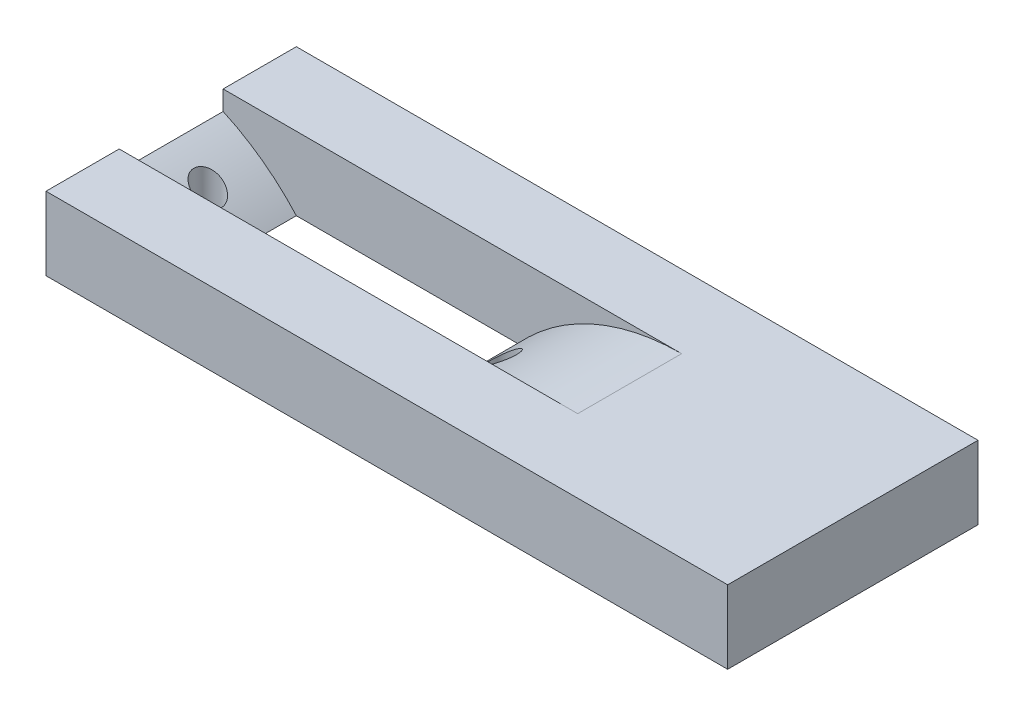
ISO-10303-21;
HEADER;
FILE_DESCRIPTION(('STEP AP214'),'2;1');
FILE_NAME('part.step','',(''),(''),'','','');
FILE_SCHEMA(('AUTOMOTIVE_DESIGN { 1 0 10303 214 1 1 1 1 }'));
ENDSEC;
DATA;
#1=APPLICATION_CONTEXT('core data for automotive mechanical design processes');
#2=APPLICATION_PROTOCOL_DEFINITION('international standard','automotive_design',2000,#1);
#3=PRODUCT_CONTEXT('',#1,'mechanical');
#4=PRODUCT('Part','Part','',(#3));
#5=PRODUCT_RELATED_PRODUCT_CATEGORY('part','',(#4));
#6=PRODUCT_DEFINITION_FORMATION('','',#4);
#7=PRODUCT_DEFINITION_CONTEXT('part definition',#1,'design');
#8=PRODUCT_DEFINITION('design','',#6,#7);
#9=PRODUCT_DEFINITION_SHAPE('','',#8);
#10=(LENGTH_UNIT() NAMED_UNIT(*) SI_UNIT(.MILLI.,.METRE.));
#11=(NAMED_UNIT(*) PLANE_ANGLE_UNIT() SI_UNIT($,.RADIAN.));
#12=(NAMED_UNIT(*) SI_UNIT($,.STERADIAN.) SOLID_ANGLE_UNIT());
#13=UNCERTAINTY_MEASURE_WITH_UNIT(LENGTH_MEASURE(1.E-05),#10,'distance_accuracy_value','');
#14=(GEOMETRIC_REPRESENTATION_CONTEXT(3) GLOBAL_UNCERTAINTY_ASSIGNED_CONTEXT((#13)) GLOBAL_UNIT_ASSIGNED_CONTEXT((#10,
#11,#12)) REPRESENTATION_CONTEXT('',''));
#15=CARTESIAN_POINT('',(0.,0.,0.));
#16=DIRECTION('',(0.,0.,1.));
#17=DIRECTION('',(1.,0.,0.));
#18=AXIS2_PLACEMENT_3D('',#15,#16,#17);
#19=CARTESIAN_POINT('',(0.,15.7457363650206,0.));
#20=DIRECTION('',(0.,-1.,0.));
#21=DIRECTION('',(0.,0.,-1.));
#22=AXIS2_PLACEMENT_3D('',#19,#20,#21);
#23=PLANE('',#22);
#24=CARTESIAN_POINT('',(-48.9900000000017,15.7457363650206,0.));
#25=DIRECTION('',(0.,1.,0.));
#26=DIRECTION('',(0.,0.,1.));
#27=AXIS2_PLACEMENT_3D('',#24,#25,#26);
#28=CIRCLE('',#27,1.91000000000001);
#29=CARTESIAN_POINT('',(-48.9900000000017,15.7457363650206,1.91000000000001));
#30=VERTEX_POINT('',#29);
#31=EDGE_CURVE('E235',#30,#30,#28,.T.);
#32=ORIENTED_EDGE('',*,*,#31,.T.);
#33=EDGE_LOOP('',(#32));
#34=FACE_BOUND('',#33,.T.);
#35=CARTESIAN_POINT('',(-8.71000000000389,15.7457363650206,0.));
#36=DIRECTION('',(0.,1.,0.));
#37=DIRECTION('',(0.,0.,1.));
#38=AXIS2_PLACEMENT_3D('',#35,#36,#37);
#39=CIRCLE('',#38,1.91);
#40=CARTESIAN_POINT('',(-8.71000000000389,15.7457363650206,1.91));
#41=VERTEX_POINT('',#40);
#42=EDGE_CURVE('E234',#41,#41,#39,.T.);
#43=ORIENTED_EDGE('',*,*,#42,.T.);
#44=EDGE_LOOP('',(#43));
#45=FACE_BOUND('',#44,.T.);
#46=DIRECTION('',(0.,0.,-1.));
#47=VECTOR('',#46,1.);
#48=CARTESIAN_POINT('',(-43.99,15.7457363650206,0.));
#49=LINE('',#48,#47);
#50=CARTESIAN_POINT('',(-43.99,15.7457363650206,7.1));
#51=VERTEX_POINT('',#50);
#52=CARTESIAN_POINT('',(-43.99,15.7457363650206,-7.1));
#53=VERTEX_POINT('',#52);
#54=EDGE_CURVE('E163',#51,#53,#49,.T.);
#55=ORIENTED_EDGE('',*,*,#54,.F.);
#56=DIRECTION('',(-1.,0.,0.));
#57=VECTOR('',#56,1.);
#58=CARTESIAN_POINT('',(0.,15.7457363650206,7.1));
#59=LINE('',#58,#57);
#60=CARTESIAN_POINT('',(-13.71,15.7457363650206,7.1));
#61=VERTEX_POINT('',#60);
#62=EDGE_CURVE('E171',#61,#51,#59,.T.);
#63=ORIENTED_EDGE('',*,*,#62,.F.);
#64=DIRECTION('',(0.,0.,1.));
#65=VECTOR('',#64,1.);
#66=CARTESIAN_POINT('',(-13.71,15.7457363650206,0.));
#67=LINE('',#66,#65);
#68=CARTESIAN_POINT('',(-13.71,15.7457363650206,-7.1));
#69=VERTEX_POINT('',#68);
#70=EDGE_CURVE('E177',#69,#61,#67,.T.);
#71=ORIENTED_EDGE('',*,*,#70,.F.);
#72=DIRECTION('',(1.,0.,0.));
#73=VECTOR('',#72,1.);
#74=CARTESIAN_POINT('',(0.,15.7457363650206,-7.1));
#75=LINE('',#74,#73);
#76=EDGE_CURVE('E183',#53,#69,#75,.T.);
#77=ORIENTED_EDGE('',*,*,#76,.F.);
#78=EDGE_LOOP('',(#55,#63,#71,#77));
#79=FACE_BOUND('',#78,.T.);
#80=DIRECTION('',(0.,0.,-1.));
#81=VECTOR('',#80,1.);
#82=CARTESIAN_POINT('',(39.14,15.7457363650206,17.1));
#83=LINE('',#82,#81);
#84=CARTESIAN_POINT('',(39.14,15.7457363650206,17.1));
#85=VERTEX_POINT('',#84);
#86=CARTESIAN_POINT('',(39.14,15.7457363650206,-17.1));
#87=VERTEX_POINT('',#86);
#88=EDGE_CURVE('E201',#85,#87,#83,.T.);
#89=ORIENTED_EDGE('',*,*,#88,.F.);
#90=DIRECTION('',(1.,0.,0.));
#91=VECTOR('',#90,1.);
#92=CARTESIAN_POINT('',(24.14,15.7457363650206,17.1));
#93=LINE('',#92,#91);
#94=CARTESIAN_POINT('',(-53.99,15.7457363650206,17.1));
#95=VERTEX_POINT('',#94);
#96=EDGE_CURVE('E206',#95,#85,#93,.T.);
#97=ORIENTED_EDGE('',*,*,#96,.F.);
#98=DIRECTION('',(0.,0.,1.));
#99=VECTOR('',#98,1.);
#100=CARTESIAN_POINT('',(-53.99,15.7457363650206,-17.1));
#101=LINE('',#100,#99);
#102=CARTESIAN_POINT('',(-53.99,15.7457363650206,-17.1));
#103=VERTEX_POINT('',#102);
#104=EDGE_CURVE('E187',#103,#95,#101,.T.);
#105=ORIENTED_EDGE('',*,*,#104,.F.);
#106=DIRECTION('',(-1.,0.,0.));
#107=VECTOR('',#106,1.);
#108=CARTESIAN_POINT('',(24.14,15.7457363650206,-17.1));
#109=LINE('',#108,#107);
#110=EDGE_CURVE('E214',#87,#103,#109,.T.);
#111=ORIENTED_EDGE('',*,*,#110,.F.);
#112=EDGE_LOOP('',(#89,#97,#105,#111));
#113=FACE_BOUND('',#112,.T.);
#114=ADVANCED_FACE('F80',(#34,#45,#79,#113),#23,.T.);
#115=CARTESIAN_POINT('',(39.14,25.7457363650206,17.1));
#116=DIRECTION('',(-1.,0.,0.));
#117=DIRECTION('',(0.,0.,1.));
#118=AXIS2_PLACEMENT_3D('',#115,#116,#117);
#119=PLANE('',#118);
#120=ORIENTED_EDGE('',*,*,#88,.T.);
#121=DIRECTION('',(0.,-1.,0.));
#122=VECTOR('',#121,1.);
#123=CARTESIAN_POINT('',(39.14,25.7457363650206,-17.1));
#124=LINE('',#123,#122);
#125=CARTESIAN_POINT('',(39.14,25.7457363650206,-17.1));
#126=VERTEX_POINT('',#125);
#127=EDGE_CURVE('E219',#126,#87,#124,.T.);
#128=ORIENTED_EDGE('',*,*,#127,.F.);
#129=DIRECTION('',(0.,0.,-1.));
#130=VECTOR('',#129,1.);
#131=CARTESIAN_POINT('',(39.14,25.7457363650206,17.1));
#132=LINE('',#131,#130);
#133=CARTESIAN_POINT('',(39.14,25.7457363650206,17.1));
#134=VERTEX_POINT('',#133);
#135=EDGE_CURVE('E202',#134,#126,#132,.T.);
#136=ORIENTED_EDGE('',*,*,#135,.F.);
#137=DIRECTION('',(0.,-1.,0.));
#138=VECTOR('',#137,1.);
#139=CARTESIAN_POINT('',(39.14,25.7457363650206,17.1));
#140=LINE('',#139,#138);
#141=EDGE_CURVE('E211',#134,#85,#140,.T.);
#142=ORIENTED_EDGE('',*,*,#141,.T.);
#143=EDGE_LOOP('',(#120,#128,#136,#142));
#144=FACE_BOUND('',#143,.T.);
#145=ADVANCED_FACE('F258',(#144),#119,.F.);
#146=CARTESIAN_POINT('',(24.14,25.7457363650206,-17.1));
#147=DIRECTION('',(0.,0.,1.));
#148=DIRECTION('',(1.,0.,0.));
#149=AXIS2_PLACEMENT_3D('',#146,#147,#148);
#150=PLANE('',#149);
#151=ORIENTED_EDGE('',*,*,#110,.T.);
#152=DIRECTION('',(0.,-1.,0.));
#153=VECTOR('',#152,1.);
#154=CARTESIAN_POINT('',(-53.99,25.7457363650206,-17.1));
#155=LINE('',#154,#153);
#156=CARTESIAN_POINT('',(-53.99,25.7457363650206,-17.1));
#157=VERTEX_POINT('',#156);
#158=EDGE_CURVE('E184',#157,#103,#155,.T.);
#159=ORIENTED_EDGE('',*,*,#158,.F.);
#160=DIRECTION('',(-1.,0.,0.));
#161=VECTOR('',#160,1.);
#162=CARTESIAN_POINT('',(24.14,25.7457363650206,-17.1));
#163=LINE('',#162,#161);
#164=EDGE_CURVE('E205',#126,#157,#163,.T.);
#165=ORIENTED_EDGE('',*,*,#164,.F.);
#166=ORIENTED_EDGE('',*,*,#127,.T.);
#167=EDGE_LOOP('',(#151,#159,#165,#166));
#168=FACE_BOUND('',#167,.T.);
#169=ADVANCED_FACE('F262',(#168),#150,.F.);
#170=CARTESIAN_POINT('',(24.14,25.7457363650206,17.1));
#171=DIRECTION('',(0.,0.,-1.));
#172=DIRECTION('',(-1.,0.,0.));
#173=AXIS2_PLACEMENT_3D('',#170,#171,#172);
#174=PLANE('',#173);
#175=ORIENTED_EDGE('',*,*,#96,.T.);
#176=ORIENTED_EDGE('',*,*,#141,.F.);
#177=DIRECTION('',(1.,0.,0.));
#178=VECTOR('',#177,1.);
#179=CARTESIAN_POINT('',(24.14,25.7457363650206,17.1));
#180=LINE('',#179,#178);
#181=CARTESIAN_POINT('',(-53.99,25.7457363650206,17.1));
#182=VERTEX_POINT('',#181);
#183=EDGE_CURVE('E209',#182,#134,#180,.T.);
#184=ORIENTED_EDGE('',*,*,#183,.F.);
#185=DIRECTION('',(0.,1.,0.));
#186=VECTOR('',#185,1.);
#187=CARTESIAN_POINT('',(-53.99,25.7457363650206,17.1));
#188=LINE('',#187,#186);
#189=EDGE_CURVE('E194',#95,#182,#188,.T.);
#190=ORIENTED_EDGE('',*,*,#189,.F.);
#191=EDGE_LOOP('',(#175,#176,#184,#190));
#192=FACE_BOUND('',#191,.T.);
#193=ADVANCED_FACE('F255',(#192),#174,.F.);
#194=CARTESIAN_POINT('',(0.,25.7457363650206,0.));
#195=DIRECTION('',(0.,-1.,0.));
#196=DIRECTION('',(0.,0.,-1.));
#197=AXIS2_PLACEMENT_3D('',#194,#195,#196);
#198=PLANE('',#197);
#199=DIRECTION('',(1.,0.,0.));
#200=VECTOR('',#199,1.);
#201=CARTESIAN_POINT('',(-13.71,25.7457363650206,7.1));
#202=LINE('',#201,#200);
#203=CARTESIAN_POINT('',(-53.99,25.7457363650206,7.1));
#204=VERTEX_POINT('',#203);
#205=CARTESIAN_POINT('',(8.6506797749979,25.7457363650206,7.1));
#206=VERTEX_POINT('',#205);
#207=EDGE_CURVE('E101',#204,#206,#202,.T.);
#208=ORIENTED_EDGE('',*,*,#207,.F.);
#209=DIRECTION('',(0.,0.,-1.));
#210=VECTOR('',#209,1.);
#211=CARTESIAN_POINT('',(-53.99,25.7457363650206,-17.1));
#212=LINE('',#211,#210);
#213=EDGE_CURVE('E198',#182,#204,#212,.T.);
#214=ORIENTED_EDGE('',*,*,#213,.F.);
#215=ORIENTED_EDGE('',*,*,#183,.T.);
#216=ORIENTED_EDGE('',*,*,#135,.T.);
#217=ORIENTED_EDGE('',*,*,#164,.T.);
#218=CARTESIAN_POINT('',(-53.99,25.7457363650206,-7.1));
#219=VERTEX_POINT('',#218);
#220=EDGE_CURVE('E197',#219,#157,#212,.T.);
#221=ORIENTED_EDGE('',*,*,#220,.F.);
#222=DIRECTION('',(-1.,0.,0.));
#223=VECTOR('',#222,1.);
#224=CARTESIAN_POINT('',(-13.71,25.7457363650206,-7.1));
#225=LINE('',#224,#223);
#226=CARTESIAN_POINT('',(8.6506797749979,25.7457363650206,-7.1));
#227=VERTEX_POINT('',#226);
#228=EDGE_CURVE('E178',#227,#219,#225,.T.);
#229=ORIENTED_EDGE('',*,*,#228,.F.);
#230=DIRECTION('',(0.,0.,-1.));
#231=VECTOR('',#230,1.);
#232=CARTESIAN_POINT('',(8.6506797749979,25.7457363650206,0.));
#233=LINE('',#232,#231);
#234=EDGE_CURVE('E222',#227,#206,#233,.F.);
#235=ORIENTED_EDGE('',*,*,#234,.T.);
#236=EDGE_LOOP('',(#208,#214,#215,#216,#217,#221,#229,#235));
#237=FACE_BOUND('',#236,.T.);
#238=ADVANCED_FACE('F251',(#237),#198,.F.);
#239=CARTESIAN_POINT('',(-53.99,0.,0.));
#240=DIRECTION('',(-1.,0.,0.));
#241=DIRECTION('',(0.,0.,1.));
#242=AXIS2_PLACEMENT_3D('',#239,#240,#241);
#243=PLANE('',#242);
#244=ORIENTED_EDGE('',*,*,#213,.T.);
#245=DIRECTION('',(0.,-1.,0.));
#246=VECTOR('',#245,1.);
#247=CARTESIAN_POINT('',(-53.99,-24.5342636349794,7.1));
#248=LINE('',#247,#246);
#249=CARTESIAN_POINT('',(-53.99,23.0809443484978,7.1));
#250=VERTEX_POINT('',#249);
#251=EDGE_CURVE('E168',#204,#250,#248,.T.);
#252=ORIENTED_EDGE('',*,*,#251,.T.);
#253=DIRECTION('',(0.,0.,1.));
#254=VECTOR('',#253,1.);
#255=CARTESIAN_POINT('',(-53.99,23.0809443484978,0.));
#256=LINE('',#255,#254);
#257=CARTESIAN_POINT('',(-53.99,23.0809443484978,-7.1));
#258=VERTEX_POINT('',#257);
#259=EDGE_CURVE('E164',#250,#258,#256,.F.);
#260=ORIENTED_EDGE('',*,*,#259,.T.);
#261=DIRECTION('',(0.,1.,0.));
#262=VECTOR('',#261,1.);
#263=CARTESIAN_POINT('',(-53.99,-24.5342636349794,-7.1));
#264=LINE('',#263,#262);
#265=EDGE_CURVE('E109',#258,#219,#264,.T.);
#266=ORIENTED_EDGE('',*,*,#265,.T.);
#267=ORIENTED_EDGE('',*,*,#220,.T.);
#268=ORIENTED_EDGE('',*,*,#158,.T.);
#269=ORIENTED_EDGE('',*,*,#104,.T.);
#270=ORIENTED_EDGE('',*,*,#189,.T.);
#271=EDGE_LOOP('',(#244,#252,#260,#266,#267,#268,#269,#270));
#272=FACE_BOUND('',#271,.T.);
#273=ADVANCED_FACE('F246',(#272),#243,.T.);
#274=CARTESIAN_POINT('',(-13.71,-24.5342636349794,-7.1));
#275=DIRECTION('',(0.,0.,-1.));
#276=DIRECTION('',(-1.,0.,0.));
#277=AXIS2_PLACEMENT_3D('',#274,#275,#276);
#278=PLANE('',#277);
#279=ORIENTED_EDGE('',*,*,#76,.T.);
#280=CARTESIAN_POINT('',(8.6506797749979,-4.25426363497941,-7.1));
#281=DIRECTION('',(0.,0.,-1.));
#282=DIRECTION('',(-1.,0.,0.));
#283=AXIS2_PLACEMENT_3D('',#280,#281,#282);
#284=CIRCLE('',#283,30.);
#285=EDGE_CURVE('E93',#69,#227,#284,.T.);
#286=ORIENTED_EDGE('',*,*,#285,.T.);
#287=ORIENTED_EDGE('',*,*,#228,.T.);
#288=ORIENTED_EDGE('',*,*,#265,.F.);
#289=CARTESIAN_POINT('',(-66.3506797749979,-4.25426363497941,-7.1));
#290=DIRECTION('',(0.,0.,-1.));
#291=DIRECTION('',(-1.,0.,0.));
#292=AXIS2_PLACEMENT_3D('',#289,#290,#291);
#293=CIRCLE('',#292,30.);
#294=EDGE_CURVE('E167',#258,#53,#293,.T.);
#295=ORIENTED_EDGE('',*,*,#294,.T.);
#296=EDGE_LOOP('',(#279,#286,#287,#288,#295));
#297=FACE_BOUND('',#296,.T.);
#298=ADVANCED_FACE('F243',(#297),#278,.F.);
#299=CARTESIAN_POINT('',(-13.71,-24.5342636349794,7.1));
#300=DIRECTION('',(0.,0.,1.));
#301=DIRECTION('',(1.,0.,0.));
#302=AXIS2_PLACEMENT_3D('',#299,#300,#301);
#303=PLANE('',#302);
#304=ORIENTED_EDGE('',*,*,#62,.T.);
#305=CARTESIAN_POINT('',(-66.3506797749979,-4.25426363497941,7.1));
#306=DIRECTION('',(0.,0.,1.));
#307=DIRECTION('',(1.,0.,0.));
#308=AXIS2_PLACEMENT_3D('',#305,#306,#307);
#309=CIRCLE('',#308,30.);
#310=EDGE_CURVE('E157',#51,#250,#309,.T.);
#311=ORIENTED_EDGE('',*,*,#310,.T.);
#312=ORIENTED_EDGE('',*,*,#251,.F.);
#313=ORIENTED_EDGE('',*,*,#207,.T.);
#314=CARTESIAN_POINT('',(8.6506797749979,-4.25426363497941,7.1));
#315=DIRECTION('',(0.,0.,1.));
#316=DIRECTION('',(1.,0.,0.));
#317=AXIS2_PLACEMENT_3D('',#314,#315,#316);
#318=CIRCLE('',#317,30.);
#319=EDGE_CURVE('E14',#206,#61,#318,.T.);
#320=ORIENTED_EDGE('',*,*,#319,.T.);
#321=EDGE_LOOP('',(#304,#311,#312,#313,#320));
#322=FACE_BOUND('',#321,.T.);
#323=ADVANCED_FACE('F172',(#322),#303,.F.);
#324=CARTESIAN_POINT('',(-8.71000000000389,15.7457363650206,0.));
#325=DIRECTION('',(0.,1.,0.));
#326=DIRECTION('',(0.,0.,1.));
#327=AXIS2_PLACEMENT_3D('',#324,#325,#326);
#328=CYLINDRICAL_SURFACE('',#327,1.91);
#329=ORIENTED_EDGE('',*,*,#42,.F.);
#330=EDGE_LOOP('',(#329));
#331=FACE_BOUND('',#330,.T.);
#332=CARTESIAN_POINT('',(-7.13605087420372,21.2561094593044,-1.08202779511192));
#333=CARTESIAN_POINT('',(-7.20024756078058,21.2163816597174,-1.17539865500023));
#334=CARTESIAN_POINT('',(-7.2718557488001,21.1717303577961,-1.2616977477907));
#335=CARTESIAN_POINT('',(-7.42620332658249,21.0744190806141,-1.41849586967726));
#336=CARTESIAN_POINT('',(-7.50896706345933,21.0217415542769,-1.48895941413734));
#337=CARTESIAN_POINT('',(-7.68162404214039,20.9105196626638,-1.61299747828413));
#338=CARTESIAN_POINT('',(-7.77146526515827,20.8520173973397,-1.66668302741348));
#339=CARTESIAN_POINT('',(-7.95594422947425,20.7303768194905,-1.75786619496678));
#340=CARTESIAN_POINT('',(-8.05058057518328,20.6672398534912,-1.7953684935225));
#341=CARTESIAN_POINT('',(-8.25622343594195,20.5282730605066,-1.85886222570244));
#342=CARTESIAN_POINT('',(-8.36762796401027,20.4519231133359,-1.88242478913048));
#343=CARTESIAN_POINT('',(-8.59101389135446,20.2965522027215,-1.90961274782874));
#344=CARTESIAN_POINT('',(-8.70299561180926,20.217529575229,-1.91322548327176));
#345=CARTESIAN_POINT('',(-8.94033739689373,20.0475917527178,-1.90027056349236));
#346=CARTESIAN_POINT('',(-9.06544109942406,19.9565233596904,-1.8808858606164));
#347=CARTESIAN_POINT('',(-9.31033499242755,19.7754094892768,-1.81761276729898));
#348=CARTESIAN_POINT('',(-9.43011815593394,19.6853654750453,-1.77369295404796));
#349=CARTESIAN_POINT('',(-9.66564779255005,19.5056805085867,-1.65912470256613));
#350=CARTESIAN_POINT('',(-9.78103323681541,19.4162041738026,-1.58746399386796));
#351=CARTESIAN_POINT('',(-9.99759375131572,19.2459649561557,-1.41741190077395));
#352=CARTESIAN_POINT('',(-10.098806928172,19.165178848104,-1.31909436927223));
#353=CARTESIAN_POINT('',(-10.2477267837391,19.0450036374487,-1.1366180281144));
#354=CARTESIAN_POINT('',(-10.3015197474198,19.0012323665254,-1.0602742745555));
#355=CARTESIAN_POINT('',(-10.3987116603246,18.9216853629361,-0.89739830826013));
#356=CARTESIAN_POINT('',(-10.4421178285944,18.8859040782211,-0.81087323451766));
#357=CARTESIAN_POINT('',(-10.5164818255089,18.8243475453384,-0.628124059046814));
#358=CARTESIAN_POINT('',(-10.5473146878053,18.7986728297615,-0.531813937418487));
#359=CARTESIAN_POINT('',(-10.593481471012,18.7601491226252,-0.333099958489606));
#360=CARTESIAN_POINT('',(-10.608835255148,18.7472836940618,-0.230704089845795));
#361=CARTESIAN_POINT('',(-10.6216182624441,18.7365730665827,-0.0396297794661084));
#362=CARTESIAN_POINT('',(-10.6214008476878,18.7367558098332,0.0487893569125348));
#363=CARTESIAN_POINT('',(-10.6088369463821,18.747281604433,0.224135458043341));
#364=CARTESIAN_POINT('',(-10.5964919211324,18.7576234316774,0.311062601287201));
#365=CARTESIAN_POINT('',(-10.561542746304,18.7868079433292,0.476032673720424));
#366=CARTESIAN_POINT('',(-10.5395536666424,18.8051406170084,0.554300378252504));
#367=CARTESIAN_POINT('',(-10.4866988095977,18.8490243695418,0.705597665011524));
#368=CARTESIAN_POINT('',(-10.4558316076657,18.8745766068074,0.778626404263008));
#369=CARTESIAN_POINT('',(-10.3826518512738,18.9348451018425,0.926203875323256));
#370=CARTESIAN_POINT('',(-10.3394487531819,18.9702640593003,1.00002018042535));
#371=CARTESIAN_POINT('',(-10.2453452448338,19.0468937205921,1.13925048358707));
#372=CARTESIAN_POINT('',(-10.1944380604654,19.0881095192448,1.20465699246069));
#373=CARTESIAN_POINT('',(-10.0602368431284,19.1959412070336,1.35631292313573));
#374=CARTESIAN_POINT('',(-9.97317653601057,19.2652097288101,1.43736962327939));
#375=CARTESIAN_POINT('',(-9.78900976514422,19.409878474131,1.58033868484201));
#376=CARTESIAN_POINT('',(-9.69188821160257,19.4852878704025,1.64222171839904));
#377=CARTESIAN_POINT('',(-9.48920962221897,19.6405244206779,1.74760661565483));
#378=CARTESIAN_POINT('',(-9.38356299811149,19.7203947268228,1.79087129640717));
#379=CARTESIAN_POINT('',(-9.16734620635434,19.8815220372641,1.85788799556358));
#380=CARTESIAN_POINT('',(-9.0567767400989,19.9627788430044,1.88164278436874));
#381=CARTESIAN_POINT('',(-8.8158201976577,20.1372652596178,1.91148900734185));
#382=CARTESIAN_POINT('',(-8.68497570974938,20.2304371323172,1.91434629753369));
#383=CARTESIAN_POINT('',(-8.42313571092519,20.413739567391,1.89290015029228));
#384=CARTESIAN_POINT('',(-8.29214016708829,20.5038674373118,1.8685732845006));
#385=CARTESIAN_POINT('',(-8.03608784953772,20.6771499067711,1.79208739671005));
#386=CARTESIAN_POINT('',(-7.91097738068274,20.7603774632435,1.74027931613461));
#387=CARTESIAN_POINT('',(-7.67058051647671,20.917883773141,1.60823244657127));
#388=CARTESIAN_POINT('',(-7.55527174533592,20.9921830782275,1.52806069420171));
#389=CARTESIAN_POINT('',(-7.3738159429214,21.1075861179021,1.36842135034805));
#390=CARTESIAN_POINT('',(-7.30337055500771,21.15192032846,1.29612687472239));
#391=CARTESIAN_POINT('',(-7.17321551620009,21.2331882720742,1.13876829131447));
#392=CARTESIAN_POINT('',(-7.11349983909244,21.2701261605286,1.05371140096328));
#393=CARTESIAN_POINT('',(-7.00731935439693,21.3354022048354,0.871855112970445));
#394=CARTESIAN_POINT('',(-6.9609393524676,21.3636853927648,0.77498591042985));
#395=CARTESIAN_POINT('',(-6.88467136419236,21.4100088510139,0.572656951420955));
#396=CARTESIAN_POINT('',(-6.85477331659109,21.428055370408,0.467202480976889));
#397=CARTESIAN_POINT('',(-6.81573478890933,21.4515815780531,0.263451581351671));
#398=CARTESIAN_POINT('',(-6.80466055897058,21.4582326413143,0.165657653559595));
#399=CARTESIAN_POINT('',(-6.79772558400763,21.4624001264384,-0.030659706863323));
#400=CARTESIAN_POINT('',(-6.80186052363701,21.4599191393671,-0.129182924653748));
#401=CARTESIAN_POINT('',(-6.82440025889034,21.4463598514561,-0.318002216950742));
#402=CARTESIAN_POINT('',(-6.84194841873986,21.4357976215412,-0.408440659724782));
#403=CARTESIAN_POINT('',(-6.88940862288262,21.4071161888802,-0.584692331000352));
#404=CARTESIAN_POINT('',(-6.91931241141218,21.3890020320955,-0.670508604737755));
#405=CARTESIAN_POINT('',(-6.97978875392246,21.352167327894,-0.811498610096536));
#406=CARTESIAN_POINT('',(-7.0076343062887,21.3351572317791,-0.868322198084502));
#407=CARTESIAN_POINT('',(-7.0682697730893,21.297955354089,-0.97813995253506));
#408=CARTESIAN_POINT('',(-7.10105935061465,21.2777637893099,-1.03113437957088));
#409=CARTESIAN_POINT('',(-7.13605087420372,21.2561094593044,-1.08202779511192));
#410=B_SPLINE_CURVE_WITH_KNOTS('',3,(#332,#333,#334,#335,#336,#337,#338,#339,#340,#341,#342,
#343,#344,#345,#346,#347,#348,#349,#350,#351,#352,#353,#354,#355,#356,#357,#358,#359,#360,#361,
#362,#363,#364,#365,#366,#367,#368,#369,#370,#371,#372,#373,#374,#375,#376,#377,#378,#379,#380,
#381,#382,#383,#384,#385,#386,#387,#388,#389,#390,#391,#392,#393,#394,#395,#396,#397,#398,#399,
#400,#401,#402,#403,#404,#405,#406,#407,#408,#409),.UNSPECIFIED.,.T.,.F.,(4,2,2,2,2,2,2,2,2,2,2,
2,2,2,2,2,2,2,2,2,2,2,2,2,2,2,2,2,2,2,2,2,2,2,2,2,2,2,4),(0.,0.359947445133693,
0.720693599442061,1.07899930669552,1.43720132380518,1.84688256431943,2.25682375184761,
2.72262721980721,3.18902862767068,3.67435554197893,4.15835135715347,4.46666118027825,
4.77475609500098,5.08584262198522,5.39652944317038,5.66037653626124,5.92419184135917,
6.17319168766905,6.4222315098383,6.69893777343941,6.97588877062862,7.38661514179705,
7.79796668958806,8.21441365314904,8.63080147108817,9.11048832626114,9.59058891320595,
10.064701099695,10.5377001420067,10.8671239736788,11.1963622061019,11.5276500635885,
11.8587354649189,12.1531164780251,12.4474139719071,12.7243415214086,13.0010843323841,
13.1972933292878,13.39348896163),.UNSPECIFIED.);
#411=CARTESIAN_POINT('',(-7.13605087420372,21.2561094593044,-1.08202779511192));
#412=VERTEX_POINT('',#411);
#413=EDGE_CURVE('E229',#412,#412,#410,.T.);
#414=ORIENTED_EDGE('',*,*,#413,.T.);
#415=EDGE_LOOP('',(#414));
#416=FACE_BOUND('',#415,.T.);
#417=ADVANCED_FACE('F236',(#331,#416),#328,.F.);
#418=CARTESIAN_POINT('',(-48.9900000000017,15.7457363650206,0.));
#419=DIRECTION('',(0.,1.,0.));
#420=DIRECTION('',(0.,0.,1.));
#421=AXIS2_PLACEMENT_3D('',#418,#419,#420);
#422=CYLINDRICAL_SURFACE('',#421,1.91000000000001);
#423=ORIENTED_EDGE('',*,*,#31,.F.);
#424=EDGE_LOOP('',(#423));
#425=FACE_BOUND('',#424,.T.);
#426=CARTESIAN_POINT('',(-50.5639491258013,21.2561094593075,-1.08202779511276));
#427=CARTESIAN_POINT('',(-50.6162770161457,21.2884918029622,-1.00590371979));
#428=CARTESIAN_POINT('',(-50.6637727071741,21.3176605445385,-0.924949160555848));
#429=CARTESIAN_POINT('',(-50.7470295693656,21.3685484931633,-0.754930525440327));
#430=CARTESIAN_POINT('',(-50.7827775230127,21.3902593104493,-0.665857458222142));
#431=CARTESIAN_POINT('',(-50.840833171561,21.425413619427,-0.48153137641138));
#432=CARTESIAN_POINT('',(-50.8631001443976,21.4388320648175,-0.38626059074525));
#433=CARTESIAN_POINT('',(-50.8927805882219,21.4567002404964,-0.192638968456553));
#434=CARTESIAN_POINT('',(-50.9002015949628,21.461154520966,-0.0942897202120043));
#435=CARTESIAN_POINT('',(-50.8998001289957,21.4609130451163,0.0974649567672223));
#436=CARTESIAN_POINT('',(-50.8927157469323,21.4566603350064,0.190873554154596));
#437=CARTESIAN_POINT('',(-50.865148018307,21.4400657128559,0.374940347579304));
#438=CARTESIAN_POINT('',(-50.844664736473,21.4277238398927,0.465598556901092));
#439=CARTESIAN_POINT('',(-50.7914157520251,21.395497710199,0.641413432191657));
#440=CARTESIAN_POINT('',(-50.7586953101427,21.375641243987,0.72658903210658));
#441=CARTESIAN_POINT('',(-50.6824248460171,21.3290859525216,0.889903240553474));
#442=CARTESIAN_POINT('',(-50.6388725667564,21.3023857012012,0.96804037786111));
#443=CARTESIAN_POINT('',(-50.5390682471391,21.2407675773988,1.12136548655911));
#444=CARTESIAN_POINT('',(-50.4821162609625,21.2053887283053,1.19591045193058));
#445=CARTESIAN_POINT('',(-50.3598042033346,21.1287446436466,1.33426963374883));
#446=CARTESIAN_POINT('',(-50.2944405493678,21.0874768991905,1.39807925115596));
#447=CARTESIAN_POINT('',(-50.1483564709155,20.9943630066838,1.52205221011146));
#448=CARTESIAN_POINT('',(-50.0667450838194,20.9418391698483,1.58065377592164));
#449=CARTESIAN_POINT('',(-49.8978972822598,20.8319102393835,1.68333070543143));
#450=CARTESIAN_POINT('',(-49.8106577616804,20.774502444675,1.72739796434964));
#451=CARTESIAN_POINT('',(-49.6184827613627,20.6465178792166,1.8070931358258));
#452=CARTESIAN_POINT('',(-49.5129468416454,20.5753024818836,1.84024797270155));
#453=CARTESIAN_POINT('',(-49.2999920194334,20.429551704602,1.88783637035979));
#454=CARTESIAN_POINT('',(-49.192572197414,20.3550146743917,1.90226051560164));
#455=CARTESIAN_POINT('',(-48.9621737894553,20.1928731180995,1.91377374052183));
#456=CARTESIAN_POINT('',(-48.8392540543563,20.1049720436505,1.90796984529956));
#457=CARTESIAN_POINT('',(-48.5968214750235,19.9288506814219,1.87310754162921));
#458=CARTESIAN_POINT('',(-48.4773126280356,19.8406301454835,1.8440229229008));
#459=CARTESIAN_POINT('',(-48.2358347105707,19.6596823849415,1.75980463070088));
#460=CARTESIAN_POINT('',(-48.1143642346676,19.5671195448134,1.70286572780099));
#461=CARTESIAN_POINT('',(-47.882891567357,19.3881158712843,1.56227218327229));
#462=CARTESIAN_POINT('',(-47.7728719598934,19.3016658069039,1.47865892309564));
#463=CARTESIAN_POINT('',(-47.6008137065849,19.1647607075932,1.31443665743056));
#464=CARTESIAN_POINT('',(-47.5344149319547,19.1114037190292,1.24078775881945));
#465=CARTESIAN_POINT('',(-47.4120136055655,19.0123023301506,1.0808160572851));
#466=CARTESIAN_POINT('',(-47.3559949340179,18.9665461378115,0.994513285016076));
#467=CARTESIAN_POINT('',(-47.2659279026866,18.8925512582952,0.826491392125075));
#468=CARTESIAN_POINT('',(-47.2297465298669,18.8626459157875,0.746656054105137));
#469=CARTESIAN_POINT('',(-47.1681267669536,18.81153938993,0.58028339438205));
#470=CARTESIAN_POINT('',(-47.1426825746157,18.7903335056696,0.493749722376633));
#471=CARTESIAN_POINT('',(-47.1040288112722,18.7580609060763,0.315544002551386));
#472=CARTESIAN_POINT('',(-47.0908942454819,18.747056354022,0.22384401715184));
#473=CARTESIAN_POINT('',(-47.0781496103563,18.7363792308263,0.0388597647968387));
#474=CARTESIAN_POINT('',(-47.0785338269714,18.736701871965,-0.054423816148489));
#475=CARTESIAN_POINT('',(-47.0920380793344,18.748013928929,-0.229730114388431));
#476=CARTESIAN_POINT('',(-47.1038548284755,18.7579117795951,-0.311930774488552));
#477=CARTESIAN_POINT('',(-47.1375974764184,18.7860911167197,-0.472709991743247));
#478=CARTESIAN_POINT('',(-47.1595242052859,18.8043732915607,-0.55128825090289));
#479=CARTESIAN_POINT('',(-47.2132567487479,18.8489891687986,-0.705843015759986));
#480=CARTESIAN_POINT('',(-47.245381876159,18.8755826077218,-0.781631808171013));
#481=CARTESIAN_POINT('',(-47.3177794859656,18.9351932149526,-0.926470571401331));
#482=CARTESIAN_POINT('',(-47.3580575031858,18.9682147465704,-0.995515916774754));
#483=CARTESIAN_POINT('',(-47.4645967098703,19.0550134724398,-1.15500865385267));
#484=CARTESIAN_POINT('',(-47.5345009989812,19.1115375000927,-1.24154048674033));
#485=CARTESIAN_POINT('',(-47.6849335046765,19.231886042045,-1.3988530921521));
#486=CARTESIAN_POINT('',(-47.7654784471872,19.2957220284808,-1.46960858538663));
#487=CARTESIAN_POINT('',(-47.9357259759516,19.4290919213231,-1.59625064367858));
#488=CARTESIAN_POINT('',(-48.0255440685557,19.4986948315193,-1.65190758775567));
#489=CARTESIAN_POINT('',(-48.2111475638594,19.6407368648604,-1.74710343534352));
#490=CARTESIAN_POINT('',(-48.3069318583932,19.7131754603801,-1.78664532184397));
#491=CARTESIAN_POINT('',(-48.5232005905236,19.8746141510179,-1.85624697271744));
#492=CARTESIAN_POINT('',(-48.6446666799217,19.9639143395838,-1.88260330513226));
#493=CARTESIAN_POINT('',(-48.890912605822,20.1420407849193,-1.91145655848121));
#494=CARTESIAN_POINT('',(-49.0156958489984,20.2308664323354,-1.9139279194249));
#495=CARTESIAN_POINT('',(-49.2731420393531,20.4111753561806,-1.89357521351497));
#496=CARTESIAN_POINT('',(-49.4058121007522,20.5024800247777,-1.86916741638786));
#497=CARTESIAN_POINT('',(-49.6666752594788,20.6790214373683,-1.79127947727316));
#498=CARTESIAN_POINT('',(-49.7948724034142,20.7642637424638,-1.73782637838019));
#499=CARTESIAN_POINT('',(-50.0090547025482,20.9044977764791,-1.61880793869215));
#500=CARTESIAN_POINT('',(-50.0973931803261,20.961617757861,-1.5599323292753));
#501=CARTESIAN_POINT('',(-50.2652374623055,21.0690141764093,-1.42594637013151));
#502=CARTESIAN_POINT('',(-50.3447710735568,21.1193122783607,-1.35088947347262));
#503=CARTESIAN_POINT('',(-50.44408846101,21.1815634820668,-1.23905380626329));
#504=CARTESIAN_POINT('',(-50.4692251642091,21.1972632937498,-1.20894456974232));
#505=CARTESIAN_POINT('',(-50.5178584750838,21.2275453123125,-1.14686696489381));
#506=CARTESIAN_POINT('',(-50.5413542720877,21.2421269671229,-1.11489769173346));
#507=CARTESIAN_POINT('',(-50.5639491258013,21.2561094593075,-1.08202779511276));
#508=B_SPLINE_CURVE_WITH_KNOTS('',3,(#426,#427,#428,#429,#430,#431,#432,#433,#434,#435,#436,
#437,#438,#439,#440,#441,#442,#443,#444,#445,#446,#447,#448,#449,#450,#451,#452,#453,#454,#455,
#456,#457,#458,#459,#460,#461,#462,#463,#464,#465,#466,#467,#468,#469,#470,#471,#472,#473,#474,
#475,#476,#477,#478,#479,#480,#481,#482,#483,#484,#485,#486,#487,#488,#489,#490,#491,#492,#493,
#494,#495,#496,#497,#498,#499,#500,#501,#502,#503,#504,#505,#506,#507),.UNSPECIFIED.,.T.,.F.,(4,
2,2,2,2,2,2,2,2,2,2,2,2,2,2,2,2,2,2,2,2,2,2,2,2,2,2,2,2,2,2,2,2,2,2,2,2,2,2,2,4),(0.,
0.293515330699657,0.587359777217695,0.882087469081859,1.17666552034734,1.45662699889781,
1.73658712501088,2.01552186102955,2.29451476712174,2.59409327191032,2.89379979158482,
3.23260683486749,3.5716024893188,3.96475707861927,4.35810922239053,4.80988567303759,
5.26217146654461,5.748694983308,6.23446736904186,6.57108806677546,6.90718154589017,
7.18389908571627,7.46046689859617,7.73870914705349,8.01683379091881,8.2665846061295,
8.51635593043066,8.7748813774561,9.03358292415933,9.40588458273058,9.77877858058508,
10.1570606992637,10.5352727639114,10.9924502673021,11.4501169553009,11.9362646931191,
12.4219605689287,12.782264690747,13.1413963435412,13.2680722695378,13.3948103420304),.UNSPECIFIED.);
#509=CARTESIAN_POINT('',(-50.5639491258013,21.2561094593075,-1.08202779511276));
#510=VERTEX_POINT('',#509);
#511=EDGE_CURVE('E85',#510,#510,#508,.T.);
#512=ORIENTED_EDGE('',*,*,#511,.T.);
#513=EDGE_LOOP('',(#512));
#514=FACE_BOUND('',#513,.T.);
#515=ADVANCED_FACE('F240',(#425,#514),#422,.F.);
#516=CARTESIAN_POINT('',(-66.3506797749979,-4.25426363497941,7.1));
#517=DIRECTION('',(0.,0.,1.));
#518=DIRECTION('',(1.,0.,0.));
#519=AXIS2_PLACEMENT_3D('',#516,#517,#518);
#520=CYLINDRICAL_SURFACE('',#519,30.);
#521=ORIENTED_EDGE('',*,*,#294,.F.);
#522=ORIENTED_EDGE('',*,*,#259,.F.);
#523=ORIENTED_EDGE('',*,*,#310,.F.);
#524=ORIENTED_EDGE('',*,*,#54,.T.);
#525=EDGE_LOOP('',(#521,#522,#523,#524));
#526=FACE_BOUND('',#525,.T.);
#527=ORIENTED_EDGE('',*,*,#511,.F.);
#528=EDGE_LOOP('',(#527));
#529=FACE_BOUND('',#528,.T.);
#530=ADVANCED_FACE('F160',(#526,#529),#520,.T.);
#531=CARTESIAN_POINT('',(8.6506797749979,-4.25426363497941,7.1));
#532=DIRECTION('',(0.,0.,-1.));
#533=DIRECTION('',(-1.,0.,0.));
#534=AXIS2_PLACEMENT_3D('',#531,#532,#533);
#535=CYLINDRICAL_SURFACE('',#534,30.);
#536=ORIENTED_EDGE('',*,*,#319,.F.);
#537=ORIENTED_EDGE('',*,*,#234,.F.);
#538=ORIENTED_EDGE('',*,*,#285,.F.);
#539=ORIENTED_EDGE('',*,*,#70,.T.);
#540=EDGE_LOOP('',(#536,#537,#538,#539));
#541=FACE_BOUND('',#540,.T.);
#542=ORIENTED_EDGE('',*,*,#413,.F.);
#543=EDGE_LOOP('',(#542));
#544=FACE_BOUND('',#543,.T.);
#545=ADVANCED_FACE('F82',(#541,#544),#535,.T.);
#546=CLOSED_SHELL('',(#114,#145,#169,#193,#238,#273,#298,#323,#417,#515,#530,#545));
#547=MANIFOLD_SOLID_BREP('B2',#546);
#548=ADVANCED_BREP_SHAPE_REPRESENTATION('',(#18,#547),#14);
#549=SHAPE_DEFINITION_REPRESENTATION(#9,#548);
ENDSEC;
END-ISO-10303-21;
